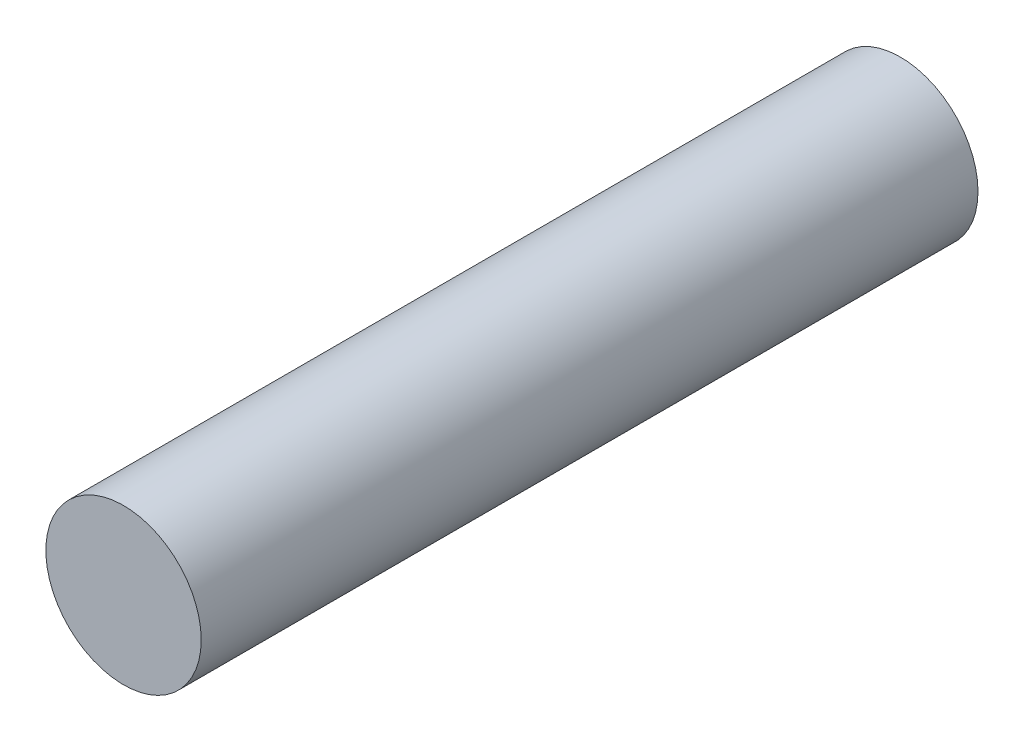
ISO-10303-21;
HEADER;
FILE_DESCRIPTION(('STEP AP214'),'2;1');
FILE_NAME('part.step','',(''),(''),'','','');
FILE_SCHEMA(('AUTOMOTIVE_DESIGN { 1 0 10303 214 1 1 1 1 }'));
ENDSEC;
DATA;
#1=APPLICATION_CONTEXT('core data for automotive mechanical design processes');
#2=APPLICATION_PROTOCOL_DEFINITION('international standard','automotive_design',2000,#1);
#3=PRODUCT_CONTEXT('',#1,'mechanical');
#4=PRODUCT('Part','Part','',(#3));
#5=PRODUCT_RELATED_PRODUCT_CATEGORY('part','',(#4));
#6=PRODUCT_DEFINITION_FORMATION('','',#4);
#7=PRODUCT_DEFINITION_CONTEXT('part definition',#1,'design');
#8=PRODUCT_DEFINITION('design','',#6,#7);
#9=PRODUCT_DEFINITION_SHAPE('','',#8);
#10=(LENGTH_UNIT() NAMED_UNIT(*) SI_UNIT(.MILLI.,.METRE.));
#11=(NAMED_UNIT(*) PLANE_ANGLE_UNIT() SI_UNIT($,.RADIAN.));
#12=(NAMED_UNIT(*) SI_UNIT($,.STERADIAN.) SOLID_ANGLE_UNIT());
#13=UNCERTAINTY_MEASURE_WITH_UNIT(LENGTH_MEASURE(1.E-05),#10,'distance_accuracy_value','');
#14=(GEOMETRIC_REPRESENTATION_CONTEXT(3) GLOBAL_UNCERTAINTY_ASSIGNED_CONTEXT((#13)) GLOBAL_UNIT_ASSIGNED_CONTEXT((#10,
#11,#12)) REPRESENTATION_CONTEXT('',''));
#15=CARTESIAN_POINT('',(0.,0.,0.));
#16=DIRECTION('',(0.,0.,1.));
#17=DIRECTION('',(1.,0.,0.));
#18=AXIS2_PLACEMENT_3D('',#15,#16,#17);
#19=CARTESIAN_POINT('',(0.,0.,60.));
#20=DIRECTION('',(0.,0.,-1.));
#21=DIRECTION('',(-1.,0.,0.));
#22=AXIS2_PLACEMENT_3D('',#19,#20,#21);
#23=CYLINDRICAL_SURFACE('',#22,6.);
#24=CARTESIAN_POINT('',(0.,0.,60.));
#25=DIRECTION('',(0.,0.,1.));
#26=DIRECTION('',(1.,0.,0.));
#27=AXIS2_PLACEMENT_3D('',#24,#25,#26);
#28=CIRCLE('',#27,6.);
#29=CARTESIAN_POINT('',(6.,0.,60.));
#30=VERTEX_POINT('',#29);
#31=EDGE_CURVE('E10',#30,#30,#28,.T.);
#32=ORIENTED_EDGE('',*,*,#31,.F.);
#33=EDGE_LOOP('',(#32));
#34=FACE_BOUND('',#33,.T.);
#35=CARTESIAN_POINT('',(0.,0.,0.));
#36=DIRECTION('',(0.,0.,1.));
#37=DIRECTION('',(1.,0.,0.));
#38=AXIS2_PLACEMENT_3D('',#35,#36,#37);
#39=CIRCLE('',#38,6.);
#40=CARTESIAN_POINT('',(6.,0.,0.));
#41=VERTEX_POINT('',#40);
#42=EDGE_CURVE('E36',#41,#41,#39,.T.);
#43=ORIENTED_EDGE('',*,*,#42,.T.);
#44=EDGE_LOOP('',(#43));
#45=FACE_BOUND('',#44,.T.);
#46=ADVANCED_FACE('F33',(#34,#45),#23,.T.);
#47=CARTESIAN_POINT('',(0.,0.,60.));
#48=DIRECTION('',(0.,0.,1.));
#49=DIRECTION('',(1.,0.,0.));
#50=AXIS2_PLACEMENT_3D('',#47,#48,#49);
#51=PLANE('',#50);
#52=ORIENTED_EDGE('',*,*,#31,.T.);
#53=EDGE_LOOP('',(#52));
#54=FACE_BOUND('',#53,.T.);
#55=ADVANCED_FACE('F48',(#54),#51,.T.);
#56=CARTESIAN_POINT('',(0.,0.,0.));
#57=DIRECTION('',(0.,0.,1.));
#58=DIRECTION('',(1.,0.,0.));
#59=AXIS2_PLACEMENT_3D('',#56,#57,#58);
#60=PLANE('',#59);
#61=ORIENTED_EDGE('',*,*,#42,.F.);
#62=EDGE_LOOP('',(#61));
#63=FACE_BOUND('',#62,.T.);
#64=ADVANCED_FACE('F46',(#63),#60,.F.);
#65=CLOSED_SHELL('',(#46,#55,#64));
#66=MANIFOLD_SOLID_BREP('B2',#65);
#67=ADVANCED_BREP_SHAPE_REPRESENTATION('',(#18,#66),#14);
#68=SHAPE_DEFINITION_REPRESENTATION(#9,#67);
ENDSEC;
END-ISO-10303-21;
